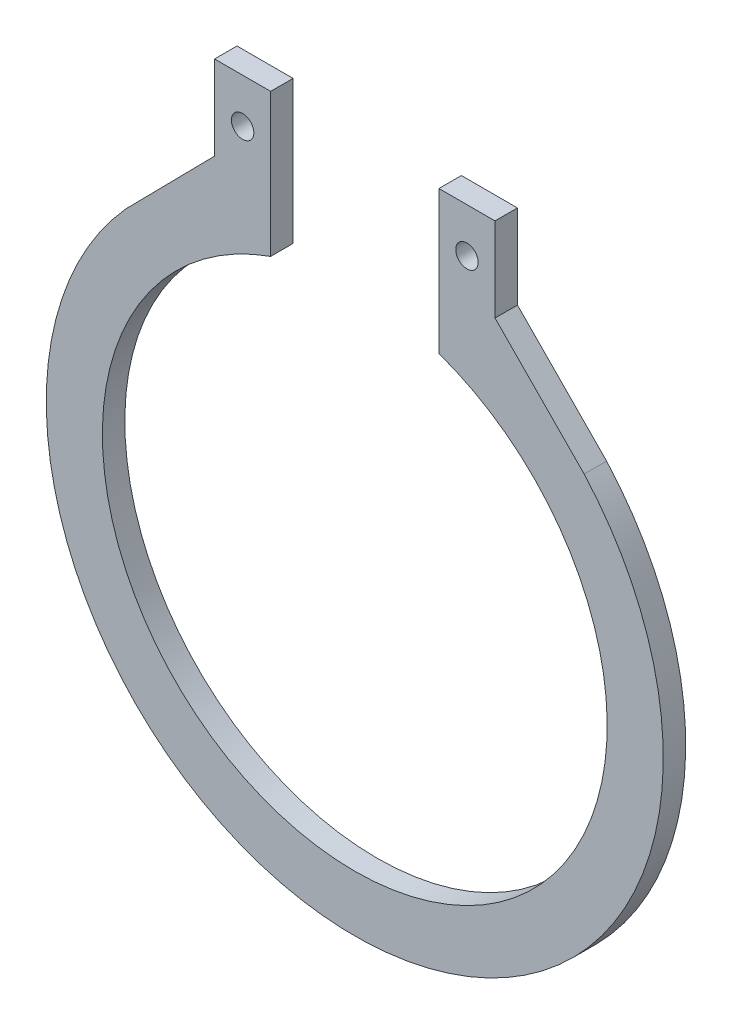
ISO-10303-21;
HEADER;
FILE_DESCRIPTION(('STEP AP214'),'2;1');
FILE_NAME('part.step','',(''),(''),'','','');
FILE_SCHEMA(('AUTOMOTIVE_DESIGN { 1 0 10303 214 1 1 1 1 }'));
ENDSEC;
DATA;
#1=APPLICATION_CONTEXT('core data for automotive mechanical design processes');
#2=APPLICATION_PROTOCOL_DEFINITION('international standard','automotive_design',2000,#1);
#3=PRODUCT_CONTEXT('',#1,'mechanical');
#4=PRODUCT('Part','Part','',(#3));
#5=PRODUCT_RELATED_PRODUCT_CATEGORY('part','',(#4));
#6=PRODUCT_DEFINITION_FORMATION('','',#4);
#7=PRODUCT_DEFINITION_CONTEXT('part definition',#1,'design');
#8=PRODUCT_DEFINITION('design','',#6,#7);
#9=PRODUCT_DEFINITION_SHAPE('','',#8);
#10=(LENGTH_UNIT() NAMED_UNIT(*) SI_UNIT(.MILLI.,.METRE.));
#11=(NAMED_UNIT(*) PLANE_ANGLE_UNIT() SI_UNIT($,.RADIAN.));
#12=(NAMED_UNIT(*) SI_UNIT($,.STERADIAN.) SOLID_ANGLE_UNIT());
#13=UNCERTAINTY_MEASURE_WITH_UNIT(LENGTH_MEASURE(1.E-05),#10,'distance_accuracy_value','');
#14=(GEOMETRIC_REPRESENTATION_CONTEXT(3) GLOBAL_UNCERTAINTY_ASSIGNED_CONTEXT((#13)) GLOBAL_UNIT_ASSIGNED_CONTEXT((#10,
#11,#12)) REPRESENTATION_CONTEXT('',''));
#15=CARTESIAN_POINT('',(0.,0.,0.));
#16=DIRECTION('',(0.,0.,1.));
#17=DIRECTION('',(1.,0.,0.));
#18=AXIS2_PLACEMENT_3D('',#15,#16,#17);
#19=CARTESIAN_POINT('',(0.,0.,2.));
#20=DIRECTION('',(0.,0.,-1.));
#21=DIRECTION('',(-1.,0.,0.));
#22=AXIS2_PLACEMENT_3D('',#19,#20,#21);
#23=CYLINDRICAL_SURFACE('',#22,27.5);
#24=CARTESIAN_POINT('',(0.,0.,0.));
#25=DIRECTION('',(0.,0.,-1.));
#26=DIRECTION('',(-1.,0.,0.));
#27=AXIS2_PLACEMENT_3D('',#24,#25,#26);
#28=CIRCLE('',#27,27.5);
#29=CARTESIAN_POINT('',(20.4466991261266,18.3897388465866,0.));
#30=VERTEX_POINT('',#29);
#31=CARTESIAN_POINT('',(-20.4466991261266,18.3897388465866,0.));
#32=VERTEX_POINT('',#31);
#33=EDGE_CURVE('E126',#30,#32,#28,.T.);
#34=ORIENTED_EDGE('',*,*,#33,.F.);
#35=DIRECTION('',(0.,0.,-1.));
#36=VECTOR('',#35,1.);
#37=CARTESIAN_POINT('',(20.4466991261266,18.3897388465866,2.));
#38=LINE('',#37,#36);
#39=CARTESIAN_POINT('',(20.4466991261266,18.3897388465866,2.));
#40=VERTEX_POINT('',#39);
#41=EDGE_CURVE('E11',#40,#30,#38,.T.);
#42=ORIENTED_EDGE('',*,*,#41,.F.);
#43=CARTESIAN_POINT('',(0.,0.,2.));
#44=DIRECTION('',(0.,0.,-1.));
#45=DIRECTION('',(-1.,0.,0.));
#46=AXIS2_PLACEMENT_3D('',#43,#44,#45);
#47=CIRCLE('',#46,27.5);
#48=CARTESIAN_POINT('',(-20.4466991261266,18.3897388465866,2.));
#49=VERTEX_POINT('',#48);
#50=EDGE_CURVE('E163',#40,#49,#47,.T.);
#51=ORIENTED_EDGE('',*,*,#50,.T.);
#52=DIRECTION('',(0.,0.,-1.));
#53=VECTOR('',#52,1.);
#54=CARTESIAN_POINT('',(-20.4466991261266,18.3897388465866,2.));
#55=LINE('',#54,#53);
#56=EDGE_CURVE('E49',#49,#32,#55,.T.);
#57=ORIENTED_EDGE('',*,*,#56,.T.);
#58=EDGE_LOOP('',(#34,#42,#51,#57));
#59=FACE_BOUND('',#58,.T.);
#60=ADVANCED_FACE('F34',(#59),#23,.T.);
#61=CARTESIAN_POINT('',(-12.3045583502715,51.6399913086372,2.));
#62=DIRECTION('',(-0.712432400304153,-0.701740746285167,0.));
#63=DIRECTION('',(0.701740746285167,-0.712432400304153,0.));
#64=AXIS2_PLACEMENT_3D('',#61,#62,#63);
#65=PLANE('',#64);
#66=DIRECTION('',(-0.701740746285167,0.712432400304153,0.));
#67=VECTOR('',#66,1.);
#68=CARTESIAN_POINT('',(-12.3045583502715,51.6399913086372,0.));
#69=LINE('',#68,#67);
#70=CARTESIAN_POINT('',(12.5,26.4575131106459,0.));
#71=VERTEX_POINT('',#70);
#72=EDGE_CURVE('E115',#30,#71,#69,.T.);
#73=ORIENTED_EDGE('',*,*,#72,.T.);
#74=DIRECTION('',(0.,0.,-1.));
#75=VECTOR('',#74,1.);
#76=CARTESIAN_POINT('',(12.5,26.4575131106459,2.));
#77=LINE('',#76,#75);
#78=CARTESIAN_POINT('',(12.5,26.4575131106459,2.));
#79=VERTEX_POINT('',#78);
#80=EDGE_CURVE('E42',#79,#71,#77,.T.);
#81=ORIENTED_EDGE('',*,*,#80,.F.);
#82=DIRECTION('',(-0.701740746285167,0.712432400304153,0.));
#83=VECTOR('',#82,1.);
#84=CARTESIAN_POINT('',(-12.3045583502715,51.6399913086372,2.));
#85=LINE('',#84,#83);
#86=EDGE_CURVE('E117',#40,#79,#85,.T.);
#87=ORIENTED_EDGE('',*,*,#86,.F.);
#88=ORIENTED_EDGE('',*,*,#41,.T.);
#89=EDGE_LOOP('',(#73,#81,#87,#88));
#90=FACE_BOUND('',#89,.T.);
#91=ADVANCED_FACE('F113',(#90),#65,.F.);
#92=CARTESIAN_POINT('',(12.4999999999999,0.885026662768074,2.));
#93=DIRECTION('',(1.,0.,0.));
#94=DIRECTION('',(0.,0.,-1.));
#95=AXIS2_PLACEMENT_3D('',#92,#93,#94);
#96=PLANE('',#95);
#97=DIRECTION('',(0.,-1.,0.));
#98=VECTOR('',#97,1.);
#99=CARTESIAN_POINT('',(12.4999999999999,0.885026662768074,0.));
#100=LINE('',#99,#98);
#101=CARTESIAN_POINT('',(12.5,33.9575131106459,0.));
#102=VERTEX_POINT('',#101);
#103=EDGE_CURVE('E129',#102,#71,#100,.T.);
#104=ORIENTED_EDGE('',*,*,#103,.F.);
#105=DIRECTION('',(0.,0.,-1.));
#106=VECTOR('',#105,1.);
#107=CARTESIAN_POINT('',(12.5,33.9575131106459,2.));
#108=LINE('',#107,#106);
#109=CARTESIAN_POINT('',(12.5,33.9575131106459,2.));
#110=VERTEX_POINT('',#109);
#111=EDGE_CURVE('E204',#110,#102,#108,.T.);
#112=ORIENTED_EDGE('',*,*,#111,.F.);
#113=DIRECTION('',(0.,-1.,0.));
#114=VECTOR('',#113,1.);
#115=CARTESIAN_POINT('',(12.4999999999999,0.885026662768074,2.));
#116=LINE('',#115,#114);
#117=EDGE_CURVE('E166',#110,#79,#116,.T.);
#118=ORIENTED_EDGE('',*,*,#117,.T.);
#119=ORIENTED_EDGE('',*,*,#80,.T.);
#120=EDGE_LOOP('',(#104,#112,#118,#119));
#121=FACE_BOUND('',#120,.T.);
#122=ADVANCED_FACE('F206',(#121),#96,.T.);
#123=CARTESIAN_POINT('',(-63.8328207198544,33.9575131106459,2.));
#124=DIRECTION('',(0.,-1.,0.));
#125=DIRECTION('',(0.,0.,-1.));
#126=AXIS2_PLACEMENT_3D('',#123,#124,#125);
#127=PLANE('',#126);
#128=DIRECTION('',(-1.,0.,0.));
#129=VECTOR('',#128,1.);
#130=CARTESIAN_POINT('',(-63.8328207198544,33.9575131106459,0.));
#131=LINE('',#130,#129);
#132=CARTESIAN_POINT('',(7.50000000000001,33.9575131106459,0.));
#133=VERTEX_POINT('',#132);
#134=EDGE_CURVE('E137',#102,#133,#131,.T.);
#135=ORIENTED_EDGE('',*,*,#134,.T.);
#136=DIRECTION('',(0.,0.,-1.));
#137=VECTOR('',#136,1.);
#138=CARTESIAN_POINT('',(7.50000000000001,33.9575131106459,2.));
#139=LINE('',#138,#137);
#140=CARTESIAN_POINT('',(7.50000000000001,33.9575131106459,2.));
#141=VERTEX_POINT('',#140);
#142=EDGE_CURVE('E201',#141,#133,#139,.T.);
#143=ORIENTED_EDGE('',*,*,#142,.F.);
#144=DIRECTION('',(-1.,0.,0.));
#145=VECTOR('',#144,1.);
#146=CARTESIAN_POINT('',(-63.8328207198544,33.9575131106459,2.));
#147=LINE('',#146,#145);
#148=EDGE_CURVE('E169',#110,#141,#147,.T.);
#149=ORIENTED_EDGE('',*,*,#148,.F.);
#150=ORIENTED_EDGE('',*,*,#111,.T.);
#151=EDGE_LOOP('',(#135,#143,#149,#150));
#152=FACE_BOUND('',#151,.T.);
#153=ADVANCED_FACE('F230',(#152),#127,.F.);
#154=CARTESIAN_POINT('',(7.50000000000001,0.885026662767685,2.));
#155=DIRECTION('',(1.,0.,0.));
#156=DIRECTION('',(0.,0.,-1.));
#157=AXIS2_PLACEMENT_3D('',#154,#155,#156);
#158=PLANE('',#157);
#159=DIRECTION('',(0.,-1.,0.));
#160=VECTOR('',#159,1.);
#161=CARTESIAN_POINT('',(7.50000000000001,0.885026662767685,0.));
#162=LINE('',#161,#160);
#163=CARTESIAN_POINT('',(7.50000000000001,21.2132034355964,0.));
#164=VERTEX_POINT('',#163);
#165=EDGE_CURVE('E140',#133,#164,#162,.T.);
#166=ORIENTED_EDGE('',*,*,#165,.T.);
#167=DIRECTION('',(0.,0.,-1.));
#168=VECTOR('',#167,1.);
#169=CARTESIAN_POINT('',(7.50000000000001,21.2132034355964,2.));
#170=LINE('',#169,#168);
#171=CARTESIAN_POINT('',(7.50000000000001,21.2132034355964,2.));
#172=VERTEX_POINT('',#171);
#173=EDGE_CURVE('E198',#172,#164,#170,.T.);
#174=ORIENTED_EDGE('',*,*,#173,.F.);
#175=DIRECTION('',(0.,-1.,0.));
#176=VECTOR('',#175,1.);
#177=CARTESIAN_POINT('',(7.50000000000001,0.885026662767685,2.));
#178=LINE('',#177,#176);
#179=EDGE_CURVE('E172',#141,#172,#178,.T.);
#180=ORIENTED_EDGE('',*,*,#179,.F.);
#181=ORIENTED_EDGE('',*,*,#142,.T.);
#182=EDGE_LOOP('',(#166,#174,#180,#181));
#183=FACE_BOUND('',#182,.T.);
#184=ADVANCED_FACE('F228',(#183),#158,.F.);
#185=CARTESIAN_POINT('',(0.,0.,2.));
#186=DIRECTION('',(0.,0.,-1.));
#187=DIRECTION('',(-1.,0.,0.));
#188=AXIS2_PLACEMENT_3D('',#185,#186,#187);
#189=CYLINDRICAL_SURFACE('',#188,22.5);
#190=CARTESIAN_POINT('',(0.,0.,0.));
#191=DIRECTION('',(0.,0.,-1.));
#192=DIRECTION('',(-1.,0.,0.));
#193=AXIS2_PLACEMENT_3D('',#190,#191,#192);
#194=CIRCLE('',#193,22.5);
#195=CARTESIAN_POINT('',(-7.50000000000001,21.2132034355964,0.));
#196=VERTEX_POINT('',#195);
#197=EDGE_CURVE('E143',#164,#196,#194,.T.);
#198=ORIENTED_EDGE('',*,*,#197,.T.);
#199=DIRECTION('',(0.,0.,-1.));
#200=VECTOR('',#199,1.);
#201=CARTESIAN_POINT('',(-7.50000000000001,21.2132034355964,2.));
#202=LINE('',#201,#200);
#203=CARTESIAN_POINT('',(-7.50000000000001,21.2132034355964,2.));
#204=VERTEX_POINT('',#203);
#205=EDGE_CURVE('E196',#204,#196,#202,.T.);
#206=ORIENTED_EDGE('',*,*,#205,.F.);
#207=CARTESIAN_POINT('',(0.,0.,2.));
#208=DIRECTION('',(0.,0.,-1.));
#209=DIRECTION('',(-1.,0.,0.));
#210=AXIS2_PLACEMENT_3D('',#207,#208,#209);
#211=CIRCLE('',#210,22.5);
#212=EDGE_CURVE('E175',#172,#204,#211,.T.);
#213=ORIENTED_EDGE('',*,*,#212,.F.);
#214=ORIENTED_EDGE('',*,*,#173,.T.);
#215=EDGE_LOOP('',(#198,#206,#213,#214));
#216=FACE_BOUND('',#215,.T.);
#217=ADVANCED_FACE('F225',(#216),#189,.F.);
#218=CARTESIAN_POINT('',(-7.50000000000003,0.885026662767519,2.));
#219=DIRECTION('',(1.,0.,0.));
#220=DIRECTION('',(0.,1.,0.));
#221=AXIS2_PLACEMENT_3D('',#218,#219,#220);
#222=PLANE('',#221);
#223=DIRECTION('',(0.,-1.,0.));
#224=VECTOR('',#223,1.);
#225=CARTESIAN_POINT('',(-7.50000000000003,0.885026662767519,0.));
#226=LINE('',#225,#224);
#227=CARTESIAN_POINT('',(-7.49999999999998,33.9575131106459,0.));
#228=VERTEX_POINT('',#227);
#229=EDGE_CURVE('E146',#228,#196,#226,.T.);
#230=ORIENTED_EDGE('',*,*,#229,.F.);
#231=DIRECTION('',(0.,0.,-1.));
#232=VECTOR('',#231,1.);
#233=CARTESIAN_POINT('',(-7.49999999999998,33.9575131106459,2.));
#234=LINE('',#233,#232);
#235=CARTESIAN_POINT('',(-7.49999999999998,33.9575131106459,2.));
#236=VERTEX_POINT('',#235);
#237=EDGE_CURVE('E194',#236,#228,#234,.T.);
#238=ORIENTED_EDGE('',*,*,#237,.F.);
#239=DIRECTION('',(0.,-1.,0.));
#240=VECTOR('',#239,1.);
#241=CARTESIAN_POINT('',(-7.50000000000003,0.885026662767519,2.));
#242=LINE('',#241,#240);
#243=EDGE_CURVE('E177',#236,#204,#242,.T.);
#244=ORIENTED_EDGE('',*,*,#243,.T.);
#245=ORIENTED_EDGE('',*,*,#205,.T.);
#246=EDGE_LOOP('',(#230,#238,#244,#245));
#247=FACE_BOUND('',#246,.T.);
#248=ADVANCED_FACE('F220',(#247),#222,.T.);
#249=CARTESIAN_POINT('',(-63.8328207198544,33.9575131106459,2.));
#250=DIRECTION('',(0.,-1.,0.));
#251=DIRECTION('',(0.,0.,-1.));
#252=AXIS2_PLACEMENT_3D('',#249,#250,#251);
#253=PLANE('',#252);
#254=DIRECTION('',(-1.,0.,0.));
#255=VECTOR('',#254,1.);
#256=CARTESIAN_POINT('',(-63.8328207198544,33.9575131106459,0.));
#257=LINE('',#256,#255);
#258=CARTESIAN_POINT('',(-12.5,33.9575131106459,0.));
#259=VERTEX_POINT('',#258);
#260=EDGE_CURVE('E149',#228,#259,#257,.T.);
#261=ORIENTED_EDGE('',*,*,#260,.T.);
#262=DIRECTION('',(0.,0.,-1.));
#263=VECTOR('',#262,1.);
#264=CARTESIAN_POINT('',(-12.5,33.9575131106459,2.));
#265=LINE('',#264,#263);
#266=CARTESIAN_POINT('',(-12.5,33.9575131106459,2.));
#267=VERTEX_POINT('',#266);
#268=EDGE_CURVE('E191',#267,#259,#265,.T.);
#269=ORIENTED_EDGE('',*,*,#268,.F.);
#270=DIRECTION('',(-1.,0.,0.));
#271=VECTOR('',#270,1.);
#272=CARTESIAN_POINT('',(-63.8328207198544,33.9575131106459,2.));
#273=LINE('',#272,#271);
#274=EDGE_CURVE('E180',#236,#267,#273,.T.);
#275=ORIENTED_EDGE('',*,*,#274,.F.);
#276=ORIENTED_EDGE('',*,*,#237,.T.);
#277=EDGE_LOOP('',(#261,#269,#275,#276));
#278=FACE_BOUND('',#277,.T.);
#279=ADVANCED_FACE('F277',(#278),#253,.F.);
#280=CARTESIAN_POINT('',(-12.5000000000001,0.885026662768018,2.));
#281=DIRECTION('',(1.,0.,0.));
#282=DIRECTION('',(0.,0.,-1.));
#283=AXIS2_PLACEMENT_3D('',#280,#281,#282);
#284=PLANE('',#283);
#285=DIRECTION('',(0.,-1.,0.));
#286=VECTOR('',#285,1.);
#287=CARTESIAN_POINT('',(-12.5000000000001,0.885026662768018,0.));
#288=LINE('',#287,#286);
#289=CARTESIAN_POINT('',(-12.5,26.4575131106459,0.));
#290=VERTEX_POINT('',#289);
#291=EDGE_CURVE('E152',#259,#290,#288,.T.);
#292=ORIENTED_EDGE('',*,*,#291,.T.);
#293=DIRECTION('',(0.,0.,-1.));
#294=VECTOR('',#293,1.);
#295=CARTESIAN_POINT('',(-12.5,26.4575131106459,2.));
#296=LINE('',#295,#294);
#297=CARTESIAN_POINT('',(-12.5,26.4575131106459,2.));
#298=VERTEX_POINT('',#297);
#299=EDGE_CURVE('E189',#298,#290,#296,.T.);
#300=ORIENTED_EDGE('',*,*,#299,.F.);
#301=DIRECTION('',(0.,-1.,0.));
#302=VECTOR('',#301,1.);
#303=CARTESIAN_POINT('',(-12.5000000000001,0.885026662768018,2.));
#304=LINE('',#303,#302);
#305=EDGE_CURVE('E57',#267,#298,#304,.T.);
#306=ORIENTED_EDGE('',*,*,#305,.F.);
#307=ORIENTED_EDGE('',*,*,#268,.T.);
#308=EDGE_LOOP('',(#292,#300,#306,#307));
#309=FACE_BOUND('',#308,.T.);
#310=ADVANCED_FACE('F214',(#309),#284,.F.);
#311=CARTESIAN_POINT('',(-50.5631196948214,-12.1855325879234,2.));
#312=DIRECTION('',(-0.712432400304151,0.701740746285169,0.));
#313=DIRECTION('',(-0.701740746285169,-0.712432400304151,0.));
#314=AXIS2_PLACEMENT_3D('',#311,#312,#313);
#315=PLANE('',#314);
#316=DIRECTION('',(0.701740746285169,0.712432400304151,0.));
#317=VECTOR('',#316,1.);
#318=CARTESIAN_POINT('',(-50.5631196948214,-12.1855325879234,0.));
#319=LINE('',#318,#317);
#320=EDGE_CURVE('E155',#32,#290,#319,.T.);
#321=ORIENTED_EDGE('',*,*,#320,.F.);
#322=ORIENTED_EDGE('',*,*,#56,.F.);
#323=DIRECTION('',(0.701740746285169,0.712432400304151,0.));
#324=VECTOR('',#323,1.);
#325=CARTESIAN_POINT('',(-50.5631196948214,-12.1855325879234,2.));
#326=LINE('',#325,#324);
#327=EDGE_CURVE('E183',#49,#298,#326,.T.);
#328=ORIENTED_EDGE('',*,*,#327,.T.);
#329=ORIENTED_EDGE('',*,*,#299,.T.);
#330=EDGE_LOOP('',(#321,#322,#328,#329));
#331=FACE_BOUND('',#330,.T.);
#332=ADVANCED_FACE('F212',(#331),#315,.T.);
#333=CARTESIAN_POINT('',(-10.,30.,2.));
#334=DIRECTION('',(0.,0.,-1.));
#335=DIRECTION('',(-1.,0.,0.));
#336=AXIS2_PLACEMENT_3D('',#333,#334,#335);
#337=CYLINDRICAL_SURFACE('',#336,1.);
#338=CARTESIAN_POINT('',(-10.,30.,2.));
#339=DIRECTION('',(0.,0.,-1.));
#340=DIRECTION('',(-1.,0.,0.));
#341=AXIS2_PLACEMENT_3D('',#338,#339,#340);
#342=CIRCLE('',#341,1.);
#343=CARTESIAN_POINT('',(-11.,30.,2.));
#344=VERTEX_POINT('',#343);
#345=EDGE_CURVE('E160',#344,#344,#342,.T.);
#346=ORIENTED_EDGE('',*,*,#345,.F.);
#347=EDGE_LOOP('',(#346));
#348=FACE_BOUND('',#347,.T.);
#349=CARTESIAN_POINT('',(-10.,30.,0.));
#350=DIRECTION('',(0.,0.,-1.));
#351=DIRECTION('',(-1.,0.,0.));
#352=AXIS2_PLACEMENT_3D('',#349,#350,#351);
#353=CIRCLE('',#352,1.);
#354=CARTESIAN_POINT('',(-11.,30.,0.));
#355=VERTEX_POINT('',#354);
#356=EDGE_CURVE('E131',#355,#355,#353,.T.);
#357=ORIENTED_EDGE('',*,*,#356,.T.);
#358=EDGE_LOOP('',(#357));
#359=FACE_BOUND('',#358,.T.);
#360=ADVANCED_FACE('F36',(#348,#359),#337,.F.);
#361=CARTESIAN_POINT('',(9.99999999999998,30.,2.));
#362=DIRECTION('',(0.,0.,-1.));
#363=DIRECTION('',(-1.,0.,0.));
#364=AXIS2_PLACEMENT_3D('',#361,#362,#363);
#365=CYLINDRICAL_SURFACE('',#364,1.);
#366=CARTESIAN_POINT('',(9.99999999999998,30.,2.));
#367=DIRECTION('',(0.,0.,-1.));
#368=DIRECTION('',(-1.,0.,0.));
#369=AXIS2_PLACEMENT_3D('',#366,#367,#368);
#370=CIRCLE('',#369,1.);
#371=CARTESIAN_POINT('',(8.99999999999998,30.,2.));
#372=VERTEX_POINT('',#371);
#373=EDGE_CURVE('E185',#372,#372,#370,.T.);
#374=ORIENTED_EDGE('',*,*,#373,.F.);
#375=EDGE_LOOP('',(#374));
#376=FACE_BOUND('',#375,.T.);
#377=CARTESIAN_POINT('',(9.99999999999998,30.,0.));
#378=DIRECTION('',(0.,0.,-1.));
#379=DIRECTION('',(-1.,0.,0.));
#380=AXIS2_PLACEMENT_3D('',#377,#378,#379);
#381=CIRCLE('',#380,1.);
#382=CARTESIAN_POINT('',(8.99999999999998,30.,0.));
#383=VERTEX_POINT('',#382);
#384=EDGE_CURVE('E157',#383,#383,#381,.T.);
#385=ORIENTED_EDGE('',*,*,#384,.T.);
#386=EDGE_LOOP('',(#385));
#387=FACE_BOUND('',#386,.T.);
#388=ADVANCED_FACE('F311',(#376,#387),#365,.F.);
#389=CARTESIAN_POINT('',(-63.8328207198544,0.885026662768018,2.));
#390=DIRECTION('',(0.,0.,-1.));
#391=DIRECTION('',(-1.,0.,0.));
#392=AXIS2_PLACEMENT_3D('',#389,#390,#391);
#393=PLANE('',#392);
#394=ORIENTED_EDGE('',*,*,#345,.T.);
#395=EDGE_LOOP('',(#394));
#396=FACE_BOUND('',#395,.T.);
#397=ORIENTED_EDGE('',*,*,#50,.F.);
#398=ORIENTED_EDGE('',*,*,#86,.T.);
#399=ORIENTED_EDGE('',*,*,#117,.F.);
#400=ORIENTED_EDGE('',*,*,#148,.T.);
#401=ORIENTED_EDGE('',*,*,#179,.T.);
#402=ORIENTED_EDGE('',*,*,#212,.T.);
#403=ORIENTED_EDGE('',*,*,#243,.F.);
#404=ORIENTED_EDGE('',*,*,#274,.T.);
#405=ORIENTED_EDGE('',*,*,#305,.T.);
#406=ORIENTED_EDGE('',*,*,#327,.F.);
#407=EDGE_LOOP('',(#397,#398,#399,#400,#401,#402,#403,#404,#405,#406));
#408=FACE_BOUND('',#407,.T.);
#409=ORIENTED_EDGE('',*,*,#373,.T.);
#410=EDGE_LOOP('',(#409));
#411=FACE_BOUND('',#410,.T.);
#412=ADVANCED_FACE('F209',(#396,#408,#411),#393,.F.);
#413=CARTESIAN_POINT('',(-63.8328207198544,0.885026662768018,0.));
#414=DIRECTION('',(0.,0.,-1.));
#415=DIRECTION('',(-1.,0.,0.));
#416=AXIS2_PLACEMENT_3D('',#413,#414,#415);
#417=PLANE('',#416);
#418=ORIENTED_EDGE('',*,*,#356,.F.);
#419=EDGE_LOOP('',(#418));
#420=FACE_BOUND('',#419,.T.);
#421=ORIENTED_EDGE('',*,*,#33,.T.);
#422=ORIENTED_EDGE('',*,*,#320,.T.);
#423=ORIENTED_EDGE('',*,*,#291,.F.);
#424=ORIENTED_EDGE('',*,*,#260,.F.);
#425=ORIENTED_EDGE('',*,*,#229,.T.);
#426=ORIENTED_EDGE('',*,*,#197,.F.);
#427=ORIENTED_EDGE('',*,*,#165,.F.);
#428=ORIENTED_EDGE('',*,*,#134,.F.);
#429=ORIENTED_EDGE('',*,*,#103,.T.);
#430=ORIENTED_EDGE('',*,*,#72,.F.);
#431=EDGE_LOOP('',(#421,#422,#423,#424,#425,#426,#427,#428,#429,#430));
#432=FACE_BOUND('',#431,.T.);
#433=ORIENTED_EDGE('',*,*,#384,.F.);
#434=EDGE_LOOP('',(#433));
#435=FACE_BOUND('',#434,.T.);
#436=ADVANCED_FACE('F123',(#420,#432,#435),#417,.T.);
#437=CLOSED_SHELL('',(#60,#91,#122,#153,#184,#217,#248,#279,#310,#332,#360,#388,#412,#436));
#438=MANIFOLD_SOLID_BREP('B2',#437);
#439=ADVANCED_BREP_SHAPE_REPRESENTATION('',(#18,#438),#14);
#440=SHAPE_DEFINITION_REPRESENTATION(#9,#439);
ENDSEC;
END-ISO-10303-21;
